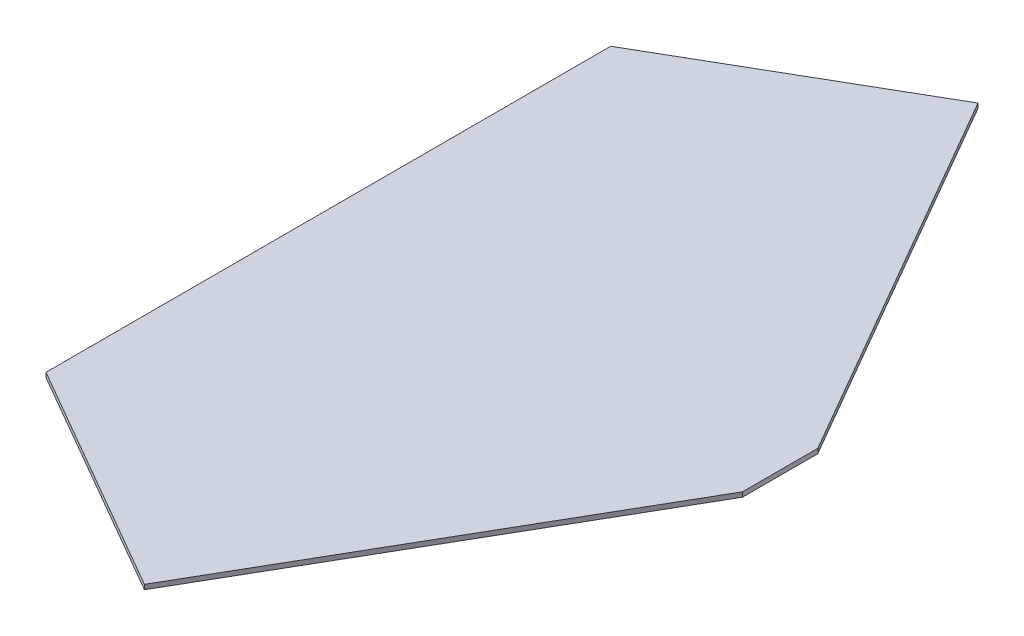
ISO-10303-21;
HEADER;
FILE_DESCRIPTION(('STEP AP214'),'2;1');
FILE_NAME('part.step','',(''),(''),'','','');
FILE_SCHEMA(('AUTOMOTIVE_DESIGN { 1 0 10303 214 1 1 1 1 }'));
ENDSEC;
DATA;
#1=APPLICATION_CONTEXT('core data for automotive mechanical design processes');
#2=APPLICATION_PROTOCOL_DEFINITION('international standard','automotive_design',2000,#1);
#3=PRODUCT_CONTEXT('',#1,'mechanical');
#4=PRODUCT('Part','Part','',(#3));
#5=PRODUCT_RELATED_PRODUCT_CATEGORY('part','',(#4));
#6=PRODUCT_DEFINITION_FORMATION('','',#4);
#7=PRODUCT_DEFINITION_CONTEXT('part definition',#1,'design');
#8=PRODUCT_DEFINITION('design','',#6,#7);
#9=PRODUCT_DEFINITION_SHAPE('','',#8);
#10=(LENGTH_UNIT() NAMED_UNIT(*) SI_UNIT(.MILLI.,.METRE.));
#11=(NAMED_UNIT(*) PLANE_ANGLE_UNIT() SI_UNIT($,.RADIAN.));
#12=(NAMED_UNIT(*) SI_UNIT($,.STERADIAN.) SOLID_ANGLE_UNIT());
#13=UNCERTAINTY_MEASURE_WITH_UNIT(LENGTH_MEASURE(1.E-05),#10,'distance_accuracy_value','');
#14=(GEOMETRIC_REPRESENTATION_CONTEXT(3) GLOBAL_UNCERTAINTY_ASSIGNED_CONTEXT((#13)) GLOBAL_UNIT_ASSIGNED_CONTEXT((#10,
#11,#12)) REPRESENTATION_CONTEXT('',''));
#15=CARTESIAN_POINT('',(0.,0.,0.));
#16=DIRECTION('',(0.,0.,1.));
#17=DIRECTION('',(1.,0.,0.));
#18=AXIS2_PLACEMENT_3D('',#15,#16,#17);
#19=CARTESIAN_POINT('',(0.,3.175,0.));
#20=DIRECTION('',(0.,1.,0.));
#21=DIRECTION('',(0.,0.,1.));
#22=AXIS2_PLACEMENT_3D('',#19,#20,#21);
#23=PLANE('',#22);
#24=DIRECTION('',(0.866025403784429,0.,0.500000000000017));
#25=VECTOR('',#24,1.);
#26=CARTESIAN_POINT('',(-248.63230795316,3.175,190.5));
#27=LINE('',#26,#25);
#28=CARTESIAN_POINT('',(-91.5227050355276,3.175,281.20727153682));
#29=VERTEX_POINT('',#28);
#30=CARTESIAN_POINT('',(-248.63230795316,3.175,190.5));
#31=VERTEX_POINT('',#30);
#32=EDGE_CURVE('E93',#29,#31,#27,.F.);
#33=ORIENTED_EDGE('',*,*,#32,.F.);
#34=DIRECTION('',(0.500000000000017,0.,-0.866025403784429));
#35=VECTOR('',#34,1.);
#36=CARTESIAN_POINT('',(-91.5227050355548,3.175,281.207271536834));
#37=LINE('',#36,#35);
#38=CARTESIAN_POINT('',(56.1676920468611,3.175,25.4000000000521));
#39=VERTEX_POINT('',#38);
#40=EDGE_CURVE('E97',#39,#29,#37,.F.);
#41=ORIENTED_EDGE('',*,*,#40,.F.);
#42=DIRECTION('',(0.,0.,-1.));
#43=VECTOR('',#42,1.);
#44=CARTESIAN_POINT('',(56.1676920468398,3.175,25.4));
#45=LINE('',#44,#43);
#46=CARTESIAN_POINT('',(56.1676920468461,3.175,-25.399999999989));
#47=VERTEX_POINT('',#46);
#48=EDGE_CURVE('E82',#47,#39,#45,.F.);
#49=ORIENTED_EDGE('',*,*,#48,.F.);
#50=DIRECTION('',(-0.500000000000017,0.,-0.866025403784429));
#51=VECTOR('',#50,1.);
#52=CARTESIAN_POINT('',(56.1676920468398,3.175,-25.4));
#53=LINE('',#52,#51);
#54=CARTESIAN_POINT('',(-91.5227050355864,3.175,-281.207271536827));
#55=VERTEX_POINT('',#54);
#56=EDGE_CURVE('E19',#55,#47,#53,.F.);
#57=ORIENTED_EDGE('',*,*,#56,.F.);
#58=DIRECTION('',(-0.866025403784429,0.,0.500000000000017));
#59=VECTOR('',#58,1.);
#60=CARTESIAN_POINT('',(-91.5227050355548,3.175,-281.207271536834));
#61=LINE('',#60,#59);
#62=CARTESIAN_POINT('',(-248.632307953163,3.175,-190.500000000055));
#63=VERTEX_POINT('',#62);
#64=EDGE_CURVE('E70',#63,#55,#61,.F.);
#65=ORIENTED_EDGE('',*,*,#64,.F.);
#66=DIRECTION('',(0.,0.,1.));
#67=VECTOR('',#66,1.);
#68=CARTESIAN_POINT('',(-248.63230795316,3.175,-190.5));
#69=LINE('',#68,#67);
#70=EDGE_CURVE('E65',#31,#63,#69,.F.);
#71=ORIENTED_EDGE('',*,*,#70,.F.);
#72=EDGE_LOOP('',(#33,#41,#49,#57,#65,#71));
#73=FACE_BOUND('',#72,.T.);
#74=ADVANCED_FACE('F16',(#73),#23,.T.);
#75=CARTESIAN_POINT('',(56.1676920468398,0.,-25.4));
#76=DIRECTION('',(0.866025403784429,0.,-0.500000000000017));
#77=DIRECTION('',(-0.500000000000017,0.,-0.866025403784429));
#78=AXIS2_PLACEMENT_3D('',#75,#76,#77);
#79=PLANE('',#78);
#80=ORIENTED_EDGE('',*,*,#56,.T.);
#81=DIRECTION('',(0.,1.,0.));
#82=VECTOR('',#81,1.);
#83=CARTESIAN_POINT('',(56.1676920468398,0.,-25.4));
#84=LINE('',#83,#82);
#85=CARTESIAN_POINT('',(56.1676920468461,0.,-25.399999999989));
#86=VERTEX_POINT('',#85);
#87=EDGE_CURVE('E101',#86,#47,#84,.T.);
#88=ORIENTED_EDGE('',*,*,#87,.F.);
#89=DIRECTION('',(-0.499999999999912,0.,-0.86602540378449));
#90=VECTOR('',#89,1.);
#91=CARTESIAN_POINT('',(56.1676920468398,0.,-25.4));
#92=LINE('',#91,#90);
#93=CARTESIAN_POINT('',(-91.5227050355942,0.,-281.207271536822));
#94=VERTEX_POINT('',#93);
#95=EDGE_CURVE('E88',#86,#94,#92,.T.);
#96=ORIENTED_EDGE('',*,*,#95,.T.);
#97=DIRECTION('',(0.,1.,0.));
#98=VECTOR('',#97,1.);
#99=CARTESIAN_POINT('',(-91.5227050355738,0.,-281.207271536823));
#100=LINE('',#99,#98);
#101=EDGE_CURVE('E75',#55,#94,#100,.F.);
#102=ORIENTED_EDGE('',*,*,#101,.F.);
#103=EDGE_LOOP('',(#80,#88,#96,#102));
#104=FACE_BOUND('',#103,.T.);
#105=ADVANCED_FACE('F87',(#104),#79,.T.);
#106=CARTESIAN_POINT('',(-91.5227050355548,0.,-281.207271536834));
#107=DIRECTION('',(-0.500000000000017,0.,-0.866025403784429));
#108=DIRECTION('',(-0.866025403784429,0.,0.500000000000017));
#109=AXIS2_PLACEMENT_3D('',#106,#107,#108);
#110=PLANE('',#109);
#111=ORIENTED_EDGE('',*,*,#64,.T.);
#112=ORIENTED_EDGE('',*,*,#101,.T.);
#113=DIRECTION('',(-0.866025403784336,0.,0.500000000000179));
#114=VECTOR('',#113,1.);
#115=CARTESIAN_POINT('',(-91.5227050355802,0.,-281.207271536834));
#116=LINE('',#115,#114);
#117=CARTESIAN_POINT('',(-248.632307953165,0.,-190.50000000006));
#118=VERTEX_POINT('',#117);
#119=EDGE_CURVE('E106',#94,#118,#116,.T.);
#120=ORIENTED_EDGE('',*,*,#119,.T.);
#121=DIRECTION('',(0.,1.,0.));
#122=VECTOR('',#121,1.);
#123=CARTESIAN_POINT('',(-248.63230795316,0.,-190.500000000051));
#124=LINE('',#123,#122);
#125=EDGE_CURVE('E77',#63,#118,#124,.F.);
#126=ORIENTED_EDGE('',*,*,#125,.F.);
#127=EDGE_LOOP('',(#111,#112,#120,#126));
#128=FACE_BOUND('',#127,.T.);
#129=ADVANCED_FACE('F72',(#128),#110,.T.);
#130=CARTESIAN_POINT('',(-248.63230795316,0.,-190.5));
#131=DIRECTION('',(-1.,0.,0.));
#132=DIRECTION('',(0.,0.,1.));
#133=AXIS2_PLACEMENT_3D('',#130,#131,#132);
#134=PLANE('',#133);
#135=ORIENTED_EDGE('',*,*,#70,.T.);
#136=ORIENTED_EDGE('',*,*,#125,.T.);
#137=DIRECTION('',(0.,0.,1.));
#138=VECTOR('',#137,1.);
#139=CARTESIAN_POINT('',(-248.63230795316,0.,0.));
#140=LINE('',#139,#138);
#141=CARTESIAN_POINT('',(-248.63230795316,0.,190.5));
#142=VERTEX_POINT('',#141);
#143=EDGE_CURVE('E108',#118,#142,#140,.T.);
#144=ORIENTED_EDGE('',*,*,#143,.T.);
#145=DIRECTION('',(0.,1.,0.));
#146=VECTOR('',#145,1.);
#147=CARTESIAN_POINT('',(-248.63230795316,0.,190.5));
#148=LINE('',#147,#146);
#149=EDGE_CURVE('E95',#31,#142,#148,.F.);
#150=ORIENTED_EDGE('',*,*,#149,.F.);
#151=EDGE_LOOP('',(#135,#136,#144,#150));
#152=FACE_BOUND('',#151,.T.);
#153=ADVANCED_FACE('F125',(#152),#134,.T.);
#154=CARTESIAN_POINT('',(-248.63230795316,0.,190.5));
#155=DIRECTION('',(-0.500000000000017,0.,0.866025403784429));
#156=DIRECTION('',(0.866025403784429,0.,0.500000000000017));
#157=AXIS2_PLACEMENT_3D('',#154,#155,#156);
#158=PLANE('',#157);
#159=ORIENTED_EDGE('',*,*,#32,.T.);
#160=ORIENTED_EDGE('',*,*,#149,.T.);
#161=DIRECTION('',(0.866025403784284,0.,0.500000000000267));
#162=VECTOR('',#161,1.);
#163=CARTESIAN_POINT('',(-248.63230795316,0.,190.5));
#164=LINE('',#163,#162);
#165=CARTESIAN_POINT('',(-91.522705035521,0.,281.207271536809));
#166=VERTEX_POINT('',#165);
#167=EDGE_CURVE('E111',#142,#166,#164,.T.);
#168=ORIENTED_EDGE('',*,*,#167,.T.);
#169=DIRECTION('',(0.,1.,0.));
#170=VECTOR('',#169,1.);
#171=CARTESIAN_POINT('',(-91.5227050355485,0.,281.207271536823));
#172=LINE('',#171,#170);
#173=EDGE_CURVE('E99',#29,#166,#172,.F.);
#174=ORIENTED_EDGE('',*,*,#173,.F.);
#175=EDGE_LOOP('',(#159,#160,#168,#174));
#176=FACE_BOUND('',#175,.T.);
#177=ADVANCED_FACE('F124',(#176),#158,.T.);
#178=CARTESIAN_POINT('',(-91.5227050355548,0.,281.207271536834));
#179=DIRECTION('',(0.866025403784429,0.,0.500000000000017));
#180=DIRECTION('',(0.500000000000017,0.,-0.866025403784429));
#181=AXIS2_PLACEMENT_3D('',#178,#179,#180);
#182=PLANE('',#181);
#183=ORIENTED_EDGE('',*,*,#40,.T.);
#184=ORIENTED_EDGE('',*,*,#173,.T.);
#185=DIRECTION('',(0.499999999999922,0.,-0.866025403784484));
#186=VECTOR('',#185,1.);
#187=CARTESIAN_POINT('',(-91.5227050355294,0.,281.207271536834));
#188=LINE('',#187,#186);
#189=CARTESIAN_POINT('',(56.1676920468634,0.,25.4000000000535));
#190=VERTEX_POINT('',#189);
#191=EDGE_CURVE('E25',#166,#190,#188,.T.);
#192=ORIENTED_EDGE('',*,*,#191,.T.);
#193=DIRECTION('',(0.,1.,0.));
#194=VECTOR('',#193,1.);
#195=CARTESIAN_POINT('',(56.1676920468398,0.,25.4000000000508));
#196=LINE('',#195,#194);
#197=EDGE_CURVE('E33',#39,#190,#196,.F.);
#198=ORIENTED_EDGE('',*,*,#197,.F.);
#199=EDGE_LOOP('',(#183,#184,#192,#198));
#200=FACE_BOUND('',#199,.T.);
#201=ADVANCED_FACE('F117',(#200),#182,.T.);
#202=CARTESIAN_POINT('',(56.1676920468398,0.,25.4));
#203=DIRECTION('',(1.,0.,0.));
#204=DIRECTION('',(0.,0.,-1.));
#205=AXIS2_PLACEMENT_3D('',#202,#203,#204);
#206=PLANE('',#205);
#207=ORIENTED_EDGE('',*,*,#48,.T.);
#208=ORIENTED_EDGE('',*,*,#197,.T.);
#209=DIRECTION('',(0.,0.,1.));
#210=VECTOR('',#209,1.);
#211=CARTESIAN_POINT('',(56.1676920468652,0.,0.));
#212=LINE('',#211,#210);
#213=EDGE_CURVE('E11',#190,#86,#212,.F.);
#214=ORIENTED_EDGE('',*,*,#213,.T.);
#215=ORIENTED_EDGE('',*,*,#87,.T.);
#216=EDGE_LOOP('',(#207,#208,#214,#215));
#217=FACE_BOUND('',#216,.T.);
#218=ADVANCED_FACE('F126',(#217),#206,.T.);
#219=CARTESIAN_POINT('',(0.,0.,0.));
#220=DIRECTION('',(0.,1.,0.));
#221=DIRECTION('',(0.,0.,1.));
#222=AXIS2_PLACEMENT_3D('',#219,#220,#221);
#223=PLANE('',#222);
#224=ORIENTED_EDGE('',*,*,#191,.F.);
#225=ORIENTED_EDGE('',*,*,#167,.F.);
#226=ORIENTED_EDGE('',*,*,#143,.F.);
#227=ORIENTED_EDGE('',*,*,#119,.F.);
#228=ORIENTED_EDGE('',*,*,#95,.F.);
#229=ORIENTED_EDGE('',*,*,#213,.F.);
#230=EDGE_LOOP('',(#224,#225,#226,#227,#228,#229));
#231=FACE_BOUND('',#230,.T.);
#232=ADVANCED_FACE('F121',(#231),#223,.F.);
#233=CLOSED_SHELL('',(#74,#105,#129,#153,#177,#201,#218,#232));
#234=MANIFOLD_SOLID_BREP('B1',#233);
#235=ADVANCED_BREP_SHAPE_REPRESENTATION('',(#18,#234),#14);
#236=SHAPE_DEFINITION_REPRESENTATION(#9,#235);
ENDSEC;
END-ISO-10303-21;
